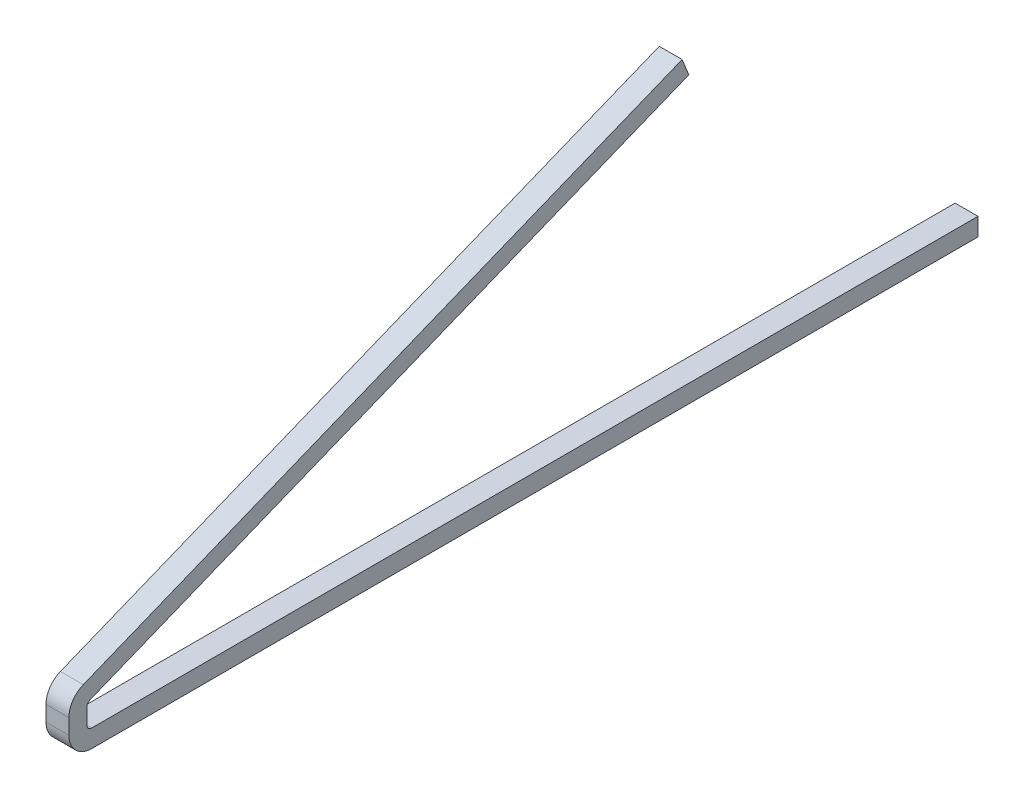
ISO-10303-21;
HEADER;
FILE_DESCRIPTION(('STEP AP214'),'2;1');
FILE_NAME('part.step','',(''),(''),'','','');
FILE_SCHEMA(('AUTOMOTIVE_DESIGN { 1 0 10303 214 1 1 1 1 }'));
ENDSEC;
DATA;
#1=APPLICATION_CONTEXT('core data for automotive mechanical design processes');
#2=APPLICATION_PROTOCOL_DEFINITION('international standard','automotive_design',2000,#1);
#3=PRODUCT_CONTEXT('',#1,'mechanical');
#4=PRODUCT('Part','Part','',(#3));
#5=PRODUCT_RELATED_PRODUCT_CATEGORY('part','',(#4));
#6=PRODUCT_DEFINITION_FORMATION('','',#4);
#7=PRODUCT_DEFINITION_CONTEXT('part definition',#1,'design');
#8=PRODUCT_DEFINITION('design','',#6,#7);
#9=PRODUCT_DEFINITION_SHAPE('','',#8);
#10=(LENGTH_UNIT() NAMED_UNIT(*) SI_UNIT(.MILLI.,.METRE.));
#11=(NAMED_UNIT(*) PLANE_ANGLE_UNIT() SI_UNIT($,.RADIAN.));
#12=(NAMED_UNIT(*) SI_UNIT($,.STERADIAN.) SOLID_ANGLE_UNIT());
#13=UNCERTAINTY_MEASURE_WITH_UNIT(LENGTH_MEASURE(1.E-05),#10,'distance_accuracy_value','');
#14=(GEOMETRIC_REPRESENTATION_CONTEXT(3) GLOBAL_UNCERTAINTY_ASSIGNED_CONTEXT((#13)) GLOBAL_UNIT_ASSIGNED_CONTEXT((#10,
#11,#12)) REPRESENTATION_CONTEXT('',''));
#15=CARTESIAN_POINT('',(0.,0.,0.));
#16=DIRECTION('',(0.,0.,1.));
#17=DIRECTION('',(1.,0.,0.));
#18=AXIS2_PLACEMENT_3D('',#15,#16,#17);
#19=CARTESIAN_POINT('',(0.,0.749999999999999,8.67499999999998));
#20=DIRECTION('',(-1.,0.,0.));
#21=DIRECTION('',(0.,0.,1.));
#22=AXIS2_PLACEMENT_3D('',#19,#20,#21);
#23=CYLINDRICAL_SURFACE('',#22,0.45);
#24=DIRECTION('',(1.,0.,0.));
#25=VECTOR('',#24,1.);
#26=CARTESIAN_POINT('',(0.,1.16723273455506,8.84357296703713));
#27=LINE('',#26,#25);
#28=CARTESIAN_POINT('',(-0.223999999999998,1.16723273455505,8.84357296703713));
#29=VERTEX_POINT('',#28);
#30=CARTESIAN_POINT('',(0.224,1.16723273455506,8.84357296703713));
#31=VERTEX_POINT('',#30);
#32=EDGE_CURVE('E36',#29,#31,#27,.T.);
#33=ORIENTED_EDGE('',*,*,#32,.F.);
#34=CARTESIAN_POINT('',(-0.223999999999998,0.749999999999999,8.67499999999998));
#35=DIRECTION('',(-1.,0.,0.));
#36=DIRECTION('',(0.,0.,1.));
#37=AXIS2_PLACEMENT_3D('',#34,#35,#36);
#38=CIRCLE('',#37,0.45);
#39=CARTESIAN_POINT('',(-0.223999999999998,0.750000000000001,9.12499999999998));
#40=VERTEX_POINT('',#39);
#41=EDGE_CURVE('E186',#40,#29,#38,.T.);
#42=ORIENTED_EDGE('',*,*,#41,.F.);
#43=DIRECTION('',(1.,0.,0.));
#44=VECTOR('',#43,1.);
#45=CARTESIAN_POINT('',(-0.223999999999998,0.750000000000001,9.12499999999998));
#46=LINE('',#45,#44);
#47=CARTESIAN_POINT('',(0.224,0.750000000000001,9.12499999999998));
#48=VERTEX_POINT('',#47);
#49=EDGE_CURVE('E11',#40,#48,#46,.T.);
#50=ORIENTED_EDGE('',*,*,#49,.T.);
#51=CARTESIAN_POINT('',(0.224,0.749999999999999,8.67499999999998));
#52=DIRECTION('',(1.,0.,0.));
#53=DIRECTION('',(0.,0.92718385456679,0.374606593415905));
#54=AXIS2_PLACEMENT_3D('',#51,#52,#53);
#55=CIRCLE('',#54,0.45);
#56=EDGE_CURVE('E179',#31,#48,#55,.T.);
#57=ORIENTED_EDGE('',*,*,#56,.F.);
#58=EDGE_LOOP('',(#33,#42,#50,#57));
#59=FACE_BOUND('',#58,.T.);
#60=ADVANCED_FACE('F17',(#59),#23,.T.);
#61=CARTESIAN_POINT('',(0.224,0.842718385456678,8.71246065934157));
#62=DIRECTION('',(1.,0.,0.));
#63=DIRECTION('',(0.,-0.92718385456679,-0.374606593415906));
#64=AXIS2_PLACEMENT_3D('',#61,#62,#63);
#65=PLANE('',#64);
#66=DIRECTION('',(0.,-0.374606593415903,0.927183854566791));
#67=VECTOR('',#66,1.);
#68=CARTESIAN_POINT('',(0.224,0.868309958802184,9.5834327994898));
#69=LINE('',#68,#67);
#70=CARTESIAN_POINT('',(0.224,5.90468421731505,-2.88203091663996));
#71=VERTEX_POINT('',#70);
#72=EDGE_CURVE('E194',#71,#31,#69,.T.);
#73=ORIENTED_EDGE('',*,*,#72,.T.);
#74=ORIENTED_EDGE('',*,*,#56,.T.);
#75=DIRECTION('',(0.,-1.,0.));
#76=VECTOR('',#75,1.);
#77=CARTESIAN_POINT('',(0.224,-0.347964534011808,9.12499999999998));
#78=LINE('',#77,#76);
#79=CARTESIAN_POINT('',(0.224,0.45,9.12499999999998));
#80=VERTEX_POINT('',#79);
#81=EDGE_CURVE('E158',#48,#80,#78,.T.);
#82=ORIENTED_EDGE('',*,*,#81,.T.);
#83=CARTESIAN_POINT('',(0.224,0.45,8.67499999999998));
#84=DIRECTION('',(1.,0.,0.));
#85=DIRECTION('',(0.,0.,1.));
#86=AXIS2_PLACEMENT_3D('',#83,#84,#85);
#87=CIRCLE('',#86,0.45);
#88=CARTESIAN_POINT('',(0.224,0.,8.67499999999998));
#89=VERTEX_POINT('',#88);
#90=EDGE_CURVE('E128',#80,#89,#87,.T.);
#91=ORIENTED_EDGE('',*,*,#90,.T.);
#92=DIRECTION('',(0.,0.,-1.));
#93=VECTOR('',#92,1.);
#94=CARTESIAN_POINT('',(0.224,0.,8.67499999999998));
#95=LINE('',#94,#93);
#96=CARTESIAN_POINT('',(0.223999999999999,0.,-8.67500000000003));
#97=VERTEX_POINT('',#96);
#98=EDGE_CURVE('E21',#89,#97,#95,.T.);
#99=ORIENTED_EDGE('',*,*,#98,.T.);
#100=DIRECTION('',(0.,1.,0.));
#101=VECTOR('',#100,1.);
#102=CARTESIAN_POINT('',(0.223999999999999,0.,-8.67500000000003));
#103=LINE('',#102,#101);
#104=CARTESIAN_POINT('',(0.223999999999999,0.35,-8.67500000000003));
#105=VERTEX_POINT('',#104);
#106=EDGE_CURVE('E104',#97,#105,#103,.T.);
#107=ORIENTED_EDGE('',*,*,#106,.T.);
#108=DIRECTION('',(0.,0.,1.));
#109=VECTOR('',#108,1.);
#110=CARTESIAN_POINT('',(0.224,0.35,8.67499999999998));
#111=LINE('',#110,#109);
#112=CARTESIAN_POINT('',(0.224,0.35,8.67499999999998));
#113=VERTEX_POINT('',#112);
#114=EDGE_CURVE('E130',#105,#113,#111,.T.);
#115=ORIENTED_EDGE('',*,*,#114,.T.);
#116=CARTESIAN_POINT('',(0.224,0.45,8.67499999999998));
#117=DIRECTION('',(1.,0.,0.));
#118=DIRECTION('',(0.,0.,1.));
#119=AXIS2_PLACEMENT_3D('',#116,#117,#118);
#120=CIRCLE('',#119,0.1);
#121=CARTESIAN_POINT('',(0.224,0.449999999999999,8.77499999999998));
#122=VERTEX_POINT('',#121);
#123=EDGE_CURVE('E141',#122,#113,#120,.T.);
#124=ORIENTED_EDGE('',*,*,#123,.F.);
#125=DIRECTION('',(0.,-1.,0.));
#126=VECTOR('',#125,1.);
#127=CARTESIAN_POINT('',(0.224,-0.347964534011809,8.77499999999998));
#128=LINE('',#127,#126);
#129=CARTESIAN_POINT('',(0.224,0.75,8.77499999999998));
#130=VERTEX_POINT('',#129);
#131=EDGE_CURVE('E152',#130,#122,#128,.T.);
#132=ORIENTED_EDGE('',*,*,#131,.F.);
#133=CARTESIAN_POINT('',(0.224,0.749999999999999,8.67499999999998));
#134=DIRECTION('',(1.,0.,0.));
#135=DIRECTION('',(0.,0.927183854566791,0.374606593415904));
#136=AXIS2_PLACEMENT_3D('',#133,#134,#135);
#137=CIRCLE('',#136,0.1);
#138=CARTESIAN_POINT('',(0.224,0.842718385456679,8.71246065934157));
#139=VERTEX_POINT('',#138);
#140=EDGE_CURVE('E165',#139,#130,#137,.T.);
#141=ORIENTED_EDGE('',*,*,#140,.F.);
#142=DIRECTION('',(0.,-0.374606593415903,0.927183854566791));
#143=VECTOR('',#142,1.);
#144=CARTESIAN_POINT('',(0.224,0.543795609703807,9.45232049179423));
#145=LINE('',#144,#143);
#146=CARTESIAN_POINT('',(0.224,5.58016986821667,-3.01314322433553));
#147=VERTEX_POINT('',#146);
#148=EDGE_CURVE('E185',#147,#139,#145,.T.);
#149=ORIENTED_EDGE('',*,*,#148,.F.);
#150=DIRECTION('',(0.,0.92718385456679,0.374606593415906));
#151=VECTOR('',#150,1.);
#152=CARTESIAN_POINT('',(0.224,5.58016986821667,-3.01314322433553));
#153=LINE('',#152,#151);
#154=EDGE_CURVE('E27',#147,#71,#153,.T.);
#155=ORIENTED_EDGE('',*,*,#154,.T.);
#156=EDGE_LOOP('',(#73,#74,#82,#91,#99,#107,#115,#124,#132,#141,#149,#155));
#157=FACE_BOUND('',#156,.T.);
#158=ADVANCED_FACE('F125',(#157),#65,.T.);
#159=CARTESIAN_POINT('',(0.,3.15498093586113,2.98941001918852));
#160=DIRECTION('',(0.,0.927183854566791,0.374606593415904));
#161=DIRECTION('',(1.,0.,0.));
#162=AXIS2_PLACEMENT_3D('',#159,#160,#161);
#163=PLANE('',#162);
#164=DIRECTION('',(-1.,0.,0.));
#165=VECTOR('',#164,1.);
#166=CARTESIAN_POINT('',(0.,0.842718385456679,8.71246065934157));
#167=LINE('',#166,#165);
#168=CARTESIAN_POINT('',(-0.223999999999998,0.842718385456679,8.71246065934157));
#169=VERTEX_POINT('',#168);
#170=EDGE_CURVE('E190',#139,#169,#167,.T.);
#171=ORIENTED_EDGE('',*,*,#170,.T.);
#172=DIRECTION('',(0.,-0.374606593415903,0.927183854566791));
#173=VECTOR('',#172,1.);
#174=CARTESIAN_POINT('',(-0.223999999999998,0.543795609703807,9.45232049179423));
#175=LINE('',#174,#173);
#176=CARTESIAN_POINT('',(-0.223999999999998,5.58016986821667,-3.01314322433553));
#177=VERTEX_POINT('',#176);
#178=EDGE_CURVE('E173',#177,#169,#175,.T.);
#179=ORIENTED_EDGE('',*,*,#178,.F.);
#180=DIRECTION('',(1.,0.,0.));
#181=VECTOR('',#180,1.);
#182=CARTESIAN_POINT('',(-0.223999999999998,5.58016986821667,-3.01314322433553));
#183=LINE('',#182,#181);
#184=EDGE_CURVE('E187',#177,#147,#183,.T.);
#185=ORIENTED_EDGE('',*,*,#184,.T.);
#186=ORIENTED_EDGE('',*,*,#148,.T.);
#187=EDGE_LOOP('',(#171,#179,#185,#186));
#188=FACE_BOUND('',#187,.T.);
#189=ADVANCED_FACE('F235',(#188),#163,.F.);
#190=CARTESIAN_POINT('',(-0.223999999999998,0.842718385456678,8.71246065934157));
#191=DIRECTION('',(-1.,0.,0.));
#192=DIRECTION('',(0.,0.,1.));
#193=AXIS2_PLACEMENT_3D('',#190,#191,#192);
#194=PLANE('',#193);
#195=ORIENTED_EDGE('',*,*,#41,.T.);
#196=DIRECTION('',(0.,0.374606593415904,-0.927183854566791));
#197=VECTOR('',#196,1.);
#198=CARTESIAN_POINT('',(-0.223999999999998,1.16723273455505,8.84357296703713));
#199=LINE('',#198,#197);
#200=CARTESIAN_POINT('',(-0.223999999999998,5.90468421731505,-2.88203091663996));
#201=VERTEX_POINT('',#200);
#202=EDGE_CURVE('E176',#29,#201,#199,.T.);
#203=ORIENTED_EDGE('',*,*,#202,.T.);
#204=DIRECTION('',(0.,0.92718385456679,0.374606593415906));
#205=VECTOR('',#204,1.);
#206=CARTESIAN_POINT('',(-0.223999999999998,5.58016986821667,-3.01314322433553));
#207=LINE('',#206,#205);
#208=EDGE_CURVE('E174',#177,#201,#207,.T.);
#209=ORIENTED_EDGE('',*,*,#208,.F.);
#210=ORIENTED_EDGE('',*,*,#178,.T.);
#211=CARTESIAN_POINT('',(-0.223999999999998,0.749999999999999,8.67499999999998));
#212=DIRECTION('',(1.,0.,0.));
#213=DIRECTION('',(0.,0.927183854566791,0.374606593415904));
#214=AXIS2_PLACEMENT_3D('',#211,#212,#213);
#215=CIRCLE('',#214,0.1);
#216=CARTESIAN_POINT('',(-0.223999999999998,0.75,8.77499999999998));
#217=VERTEX_POINT('',#216);
#218=EDGE_CURVE('E182',#169,#217,#215,.T.);
#219=ORIENTED_EDGE('',*,*,#218,.T.);
#220=DIRECTION('',(0.,-1.,0.));
#221=VECTOR('',#220,1.);
#222=CARTESIAN_POINT('',(-0.223999999999998,-0.347964534011809,8.77499999999998));
#223=LINE('',#222,#221);
#224=CARTESIAN_POINT('',(-0.223999999999998,0.449999999999999,8.77499999999998));
#225=VERTEX_POINT('',#224);
#226=EDGE_CURVE('E145',#217,#225,#223,.T.);
#227=ORIENTED_EDGE('',*,*,#226,.T.);
#228=CARTESIAN_POINT('',(-0.223999999999998,0.45,8.67499999999998));
#229=DIRECTION('',(1.,0.,0.));
#230=DIRECTION('',(0.,0.,1.));
#231=AXIS2_PLACEMENT_3D('',#228,#229,#230);
#232=CIRCLE('',#231,0.1);
#233=CARTESIAN_POINT('',(-0.223999999999998,0.35,8.67499999999998));
#234=VERTEX_POINT('',#233);
#235=EDGE_CURVE('E149',#225,#234,#232,.T.);
#236=ORIENTED_EDGE('',*,*,#235,.T.);
#237=DIRECTION('',(0.,0.,-1.));
#238=VECTOR('',#237,1.);
#239=CARTESIAN_POINT('',(-0.224000000000001,0.35,-8.67500000000003));
#240=LINE('',#239,#238);
#241=CARTESIAN_POINT('',(-0.224000000000001,0.35,-8.67500000000003));
#242=VERTEX_POINT('',#241);
#243=EDGE_CURVE('E135',#234,#242,#240,.T.);
#244=ORIENTED_EDGE('',*,*,#243,.T.);
#245=DIRECTION('',(0.,1.,0.));
#246=VECTOR('',#245,1.);
#247=CARTESIAN_POINT('',(-0.224000000000001,0.,-8.67500000000003));
#248=LINE('',#247,#246);
#249=CARTESIAN_POINT('',(-0.224000000000001,0.,-8.67500000000003));
#250=VERTEX_POINT('',#249);
#251=EDGE_CURVE('E122',#250,#242,#248,.T.);
#252=ORIENTED_EDGE('',*,*,#251,.F.);
#253=DIRECTION('',(0.,0.,1.));
#254=VECTOR('',#253,1.);
#255=CARTESIAN_POINT('',(-0.224000000000001,0.,-8.67500000000003));
#256=LINE('',#255,#254);
#257=CARTESIAN_POINT('',(-0.223999999999998,0.,8.67499999999998));
#258=VERTEX_POINT('',#257);
#259=EDGE_CURVE('E121',#250,#258,#256,.T.);
#260=ORIENTED_EDGE('',*,*,#259,.T.);
#261=CARTESIAN_POINT('',(-0.223999999999998,0.45,8.67499999999998));
#262=DIRECTION('',(-1.,0.,0.));
#263=DIRECTION('',(0.,-1.,0.));
#264=AXIS2_PLACEMENT_3D('',#261,#262,#263);
#265=CIRCLE('',#264,0.45);
#266=CARTESIAN_POINT('',(-0.223999999999998,0.45,9.12499999999998));
#267=VERTEX_POINT('',#266);
#268=EDGE_CURVE('E153',#258,#267,#265,.T.);
#269=ORIENTED_EDGE('',*,*,#268,.T.);
#270=DIRECTION('',(0.,1.,0.));
#271=VECTOR('',#270,1.);
#272=CARTESIAN_POINT('',(-0.223999999999998,0.45,9.12499999999998));
#273=LINE('',#272,#271);
#274=EDGE_CURVE('E142',#267,#40,#273,.T.);
#275=ORIENTED_EDGE('',*,*,#274,.T.);
#276=EDGE_LOOP('',(#195,#203,#209,#210,#219,#227,#236,#244,#252,#260,#269,#275));
#277=FACE_BOUND('',#276,.T.);
#278=ADVANCED_FACE('F214',(#277),#194,.T.);
#279=CARTESIAN_POINT('',(-0.223999999999998,5.58016986821667,-3.01314322433553));
#280=DIRECTION('',(0.,0.374606593415906,-0.92718385456679));
#281=DIRECTION('',(0.,0.92718385456679,0.374606593415906));
#282=AXIS2_PLACEMENT_3D('',#279,#280,#281);
#283=PLANE('',#282);
#284=DIRECTION('',(1.,0.,0.));
#285=VECTOR('',#284,1.);
#286=CARTESIAN_POINT('',(-0.223999999999998,5.90468421731504,-2.88203091663996));
#287=LINE('',#286,#285);
#288=EDGE_CURVE('E170',#201,#71,#287,.T.);
#289=ORIENTED_EDGE('',*,*,#288,.T.);
#290=ORIENTED_EDGE('',*,*,#154,.F.);
#291=ORIENTED_EDGE('',*,*,#184,.F.);
#292=ORIENTED_EDGE('',*,*,#208,.T.);
#293=EDGE_LOOP('',(#289,#290,#291,#292));
#294=FACE_BOUND('',#293,.T.);
#295=ADVANCED_FACE('F211',(#294),#283,.T.);
#296=CARTESIAN_POINT('',(0.,3.47949528495951,3.12052232688409));
#297=DIRECTION('',(0.,0.927183854566791,0.374606593415904));
#298=DIRECTION('',(1.,0.,0.));
#299=AXIS2_PLACEMENT_3D('',#296,#297,#298);
#300=PLANE('',#299);
#301=ORIENTED_EDGE('',*,*,#32,.T.);
#302=ORIENTED_EDGE('',*,*,#72,.F.);
#303=ORIENTED_EDGE('',*,*,#288,.F.);
#304=ORIENTED_EDGE('',*,*,#202,.F.);
#305=EDGE_LOOP('',(#301,#302,#303,#304));
#306=FACE_BOUND('',#305,.T.);
#307=ADVANCED_FACE('F203',(#306),#300,.T.);
#308=CARTESIAN_POINT('',(0.,0.749999999999999,8.67499999999998));
#309=DIRECTION('',(-1.,0.,0.));
#310=DIRECTION('',(0.,0.,1.));
#311=AXIS2_PLACEMENT_3D('',#308,#309,#310);
#312=CYLINDRICAL_SURFACE('',#311,0.1);
#313=ORIENTED_EDGE('',*,*,#170,.F.);
#314=ORIENTED_EDGE('',*,*,#140,.T.);
#315=DIRECTION('',(1.,0.,0.));
#316=VECTOR('',#315,1.);
#317=CARTESIAN_POINT('',(-0.223999999999998,0.75,8.77499999999998));
#318=LINE('',#317,#316);
#319=EDGE_CURVE('E159',#217,#130,#318,.T.);
#320=ORIENTED_EDGE('',*,*,#319,.F.);
#321=ORIENTED_EDGE('',*,*,#218,.F.);
#322=EDGE_LOOP('',(#313,#314,#320,#321));
#323=FACE_BOUND('',#322,.T.);
#324=ADVANCED_FACE('F233',(#323),#312,.F.);
#325=CARTESIAN_POINT('',(0.,0.45,8.67499999999998));
#326=DIRECTION('',(-1.,0.,0.));
#327=DIRECTION('',(0.,-1.,0.));
#328=AXIS2_PLACEMENT_3D('',#325,#326,#327);
#329=CYLINDRICAL_SURFACE('',#328,0.45);
#330=DIRECTION('',(1.,0.,0.));
#331=VECTOR('',#330,1.);
#332=CARTESIAN_POINT('',(0.,0.45,9.12499999999998));
#333=LINE('',#332,#331);
#334=EDGE_CURVE('E148',#267,#80,#333,.T.);
#335=ORIENTED_EDGE('',*,*,#334,.F.);
#336=ORIENTED_EDGE('',*,*,#268,.F.);
#337=DIRECTION('',(1.,0.,0.));
#338=VECTOR('',#337,1.);
#339=CARTESIAN_POINT('',(-0.223999999999998,0.,8.67499999999998));
#340=LINE('',#339,#338);
#341=EDGE_CURVE('E161',#258,#89,#340,.T.);
#342=ORIENTED_EDGE('',*,*,#341,.T.);
#343=ORIENTED_EDGE('',*,*,#90,.F.);
#344=EDGE_LOOP('',(#335,#336,#342,#343));
#345=FACE_BOUND('',#344,.T.);
#346=ADVANCED_FACE('F219',(#345),#329,.T.);
#347=CARTESIAN_POINT('',(0.,0.400508866497047,8.77499999999998));
#348=DIRECTION('',(0.,0.,-1.));
#349=DIRECTION('',(0.,1.,0.));
#350=AXIS2_PLACEMENT_3D('',#347,#348,#349);
#351=PLANE('',#350);
#352=DIRECTION('',(-1.,0.,0.));
#353=VECTOR('',#352,1.);
#354=CARTESIAN_POINT('',(0.,0.449999999999999,8.77499999999998));
#355=LINE('',#354,#353);
#356=EDGE_CURVE('E155',#122,#225,#355,.T.);
#357=ORIENTED_EDGE('',*,*,#356,.T.);
#358=ORIENTED_EDGE('',*,*,#226,.F.);
#359=ORIENTED_EDGE('',*,*,#319,.T.);
#360=ORIENTED_EDGE('',*,*,#131,.T.);
#361=EDGE_LOOP('',(#357,#358,#359,#360));
#362=FACE_BOUND('',#361,.T.);
#363=ADVANCED_FACE('F228',(#362),#351,.T.);
#364=CARTESIAN_POINT('',(0.,0.400508866497048,9.12499999999998));
#365=DIRECTION('',(0.,0.,-1.));
#366=DIRECTION('',(0.,1.,0.));
#367=AXIS2_PLACEMENT_3D('',#364,#365,#366);
#368=PLANE('',#367);
#369=ORIENTED_EDGE('',*,*,#334,.T.);
#370=ORIENTED_EDGE('',*,*,#81,.F.);
#371=ORIENTED_EDGE('',*,*,#49,.F.);
#372=ORIENTED_EDGE('',*,*,#274,.F.);
#373=EDGE_LOOP('',(#369,#370,#371,#372));
#374=FACE_BOUND('',#373,.T.);
#375=ADVANCED_FACE('F217',(#374),#368,.F.);
#376=CARTESIAN_POINT('',(0.,0.45,8.67499999999998));
#377=DIRECTION('',(-1.,0.,0.));
#378=DIRECTION('',(0.,-1.,0.));
#379=AXIS2_PLACEMENT_3D('',#376,#377,#378);
#380=CYLINDRICAL_SURFACE('',#379,0.1);
#381=ORIENTED_EDGE('',*,*,#356,.F.);
#382=ORIENTED_EDGE('',*,*,#123,.T.);
#383=DIRECTION('',(-1.,0.,0.));
#384=VECTOR('',#383,1.);
#385=CARTESIAN_POINT('',(-0.223999999999998,0.35,8.67499999999998));
#386=LINE('',#385,#384);
#387=EDGE_CURVE('E139',#113,#234,#386,.T.);
#388=ORIENTED_EDGE('',*,*,#387,.T.);
#389=ORIENTED_EDGE('',*,*,#235,.F.);
#390=EDGE_LOOP('',(#381,#382,#388,#389));
#391=FACE_BOUND('',#390,.T.);
#392=ADVANCED_FACE('F225',(#391),#380,.F.);
#393=CARTESIAN_POINT('',(-0.224000000000001,0.,-8.67500000000003));
#394=DIRECTION('',(0.,0.,-1.));
#395=DIRECTION('',(-1.,0.,0.));
#396=AXIS2_PLACEMENT_3D('',#393,#394,#395);
#397=PLANE('',#396);
#398=DIRECTION('',(1.,0.,0.));
#399=VECTOR('',#398,1.);
#400=CARTESIAN_POINT('',(0.223999999999999,0.35,-8.67500000000003));
#401=LINE('',#400,#399);
#402=EDGE_CURVE('E112',#242,#105,#401,.T.);
#403=ORIENTED_EDGE('',*,*,#402,.T.);
#404=ORIENTED_EDGE('',*,*,#106,.F.);
#405=DIRECTION('',(-1.,0.,0.));
#406=VECTOR('',#405,1.);
#407=CARTESIAN_POINT('',(0.223999999999999,0.,-8.67500000000003));
#408=LINE('',#407,#406);
#409=EDGE_CURVE('E110',#97,#250,#408,.T.);
#410=ORIENTED_EDGE('',*,*,#409,.T.);
#411=ORIENTED_EDGE('',*,*,#251,.T.);
#412=EDGE_LOOP('',(#403,#404,#410,#411));
#413=FACE_BOUND('',#412,.T.);
#414=ADVANCED_FACE('F109',(#413),#397,.T.);
#415=CARTESIAN_POINT('',(0.,0.,0.));
#416=DIRECTION('',(0.,1.,0.));
#417=DIRECTION('',(0.,0.,1.));
#418=AXIS2_PLACEMENT_3D('',#415,#416,#417);
#419=PLANE('',#418);
#420=ORIENTED_EDGE('',*,*,#341,.F.);
#421=ORIENTED_EDGE('',*,*,#259,.F.);
#422=ORIENTED_EDGE('',*,*,#409,.F.);
#423=ORIENTED_EDGE('',*,*,#98,.F.);
#424=EDGE_LOOP('',(#420,#421,#422,#423));
#425=FACE_BOUND('',#424,.T.);
#426=ADVANCED_FACE('F119',(#425),#419,.F.);
#427=CARTESIAN_POINT('',(0.,0.35,0.));
#428=DIRECTION('',(0.,1.,0.));
#429=DIRECTION('',(0.,0.,1.));
#430=AXIS2_PLACEMENT_3D('',#427,#428,#429);
#431=PLANE('',#430);
#432=ORIENTED_EDGE('',*,*,#243,.F.);
#433=ORIENTED_EDGE('',*,*,#387,.F.);
#434=ORIENTED_EDGE('',*,*,#114,.F.);
#435=ORIENTED_EDGE('',*,*,#402,.F.);
#436=EDGE_LOOP('',(#432,#433,#434,#435));
#437=FACE_BOUND('',#436,.T.);
#438=ADVANCED_FACE('F19',(#437),#431,.T.);
#439=CLOSED_SHELL('',(#60,#158,#189,#278,#295,#307,#324,#346,#363,#375,#392,#414,#426,#438));
#440=MANIFOLD_SOLID_BREP('B1',#439);
#441=ADVANCED_BREP_SHAPE_REPRESENTATION('',(#18,#440),#14);
#442=SHAPE_DEFINITION_REPRESENTATION(#9,#441);
ENDSEC;
END-ISO-10303-21;
